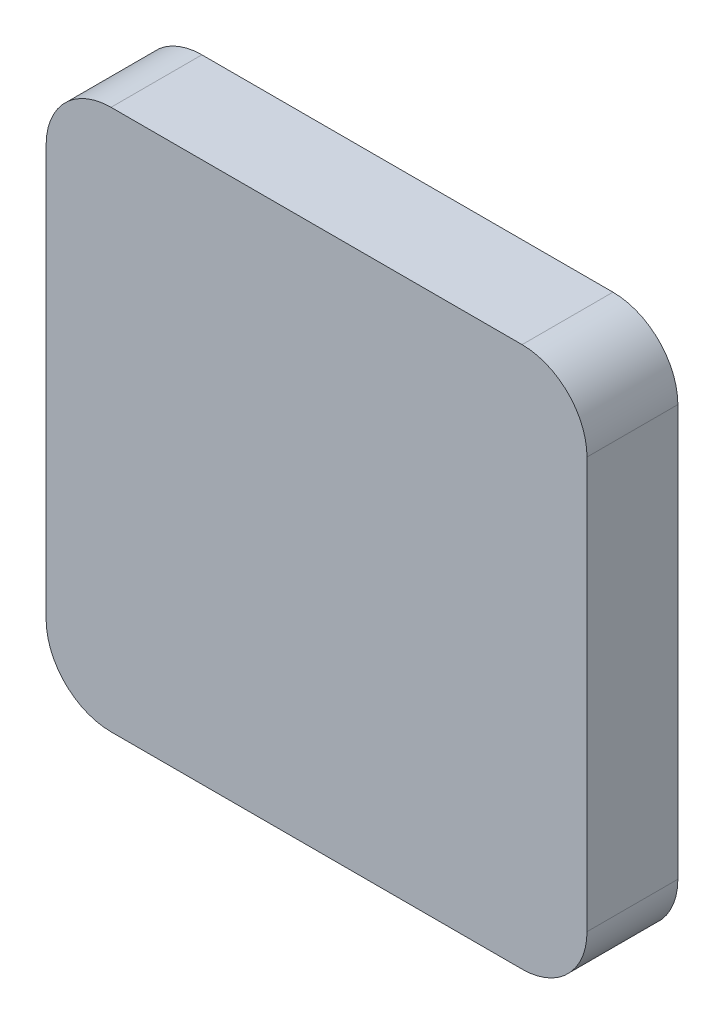
ISO-10303-21;
HEADER;
FILE_DESCRIPTION(('STEP AP214'),'2;1');
FILE_NAME('part.step','',(''),(''),'','','');
FILE_SCHEMA(('AUTOMOTIVE_DESIGN { 1 0 10303 214 1 1 1 1 }'));
ENDSEC;
DATA;
#1=APPLICATION_CONTEXT('core data for automotive mechanical design processes');
#2=APPLICATION_PROTOCOL_DEFINITION('international standard','automotive_design',2000,#1);
#3=PRODUCT_CONTEXT('',#1,'mechanical');
#4=PRODUCT('Part','Part','',(#3));
#5=PRODUCT_RELATED_PRODUCT_CATEGORY('part','',(#4));
#6=PRODUCT_DEFINITION_FORMATION('','',#4);
#7=PRODUCT_DEFINITION_CONTEXT('part definition',#1,'design');
#8=PRODUCT_DEFINITION('design','',#6,#7);
#9=PRODUCT_DEFINITION_SHAPE('','',#8);
#10=(LENGTH_UNIT() NAMED_UNIT(*) SI_UNIT(.MILLI.,.METRE.));
#11=(NAMED_UNIT(*) PLANE_ANGLE_UNIT() SI_UNIT($,.RADIAN.));
#12=(NAMED_UNIT(*) SI_UNIT($,.STERADIAN.) SOLID_ANGLE_UNIT());
#13=UNCERTAINTY_MEASURE_WITH_UNIT(LENGTH_MEASURE(1.E-05),#10,'distance_accuracy_value','');
#14=(GEOMETRIC_REPRESENTATION_CONTEXT(3) GLOBAL_UNCERTAINTY_ASSIGNED_CONTEXT((#13)) GLOBAL_UNIT_ASSIGNED_CONTEXT((#10,
#11,#12)) REPRESENTATION_CONTEXT('',''));
#15=CARTESIAN_POINT('',(0.,0.,0.));
#16=DIRECTION('',(0.,0.,1.));
#17=DIRECTION('',(1.,0.,0.));
#18=AXIS2_PLACEMENT_3D('',#15,#16,#17);
#19=CARTESIAN_POINT('',(0.,0.,8.5));
#20=DIRECTION('',(0.,0.,-1.));
#21=DIRECTION('',(-1.,0.,0.));
#22=AXIS2_PLACEMENT_3D('',#19,#20,#21);
#23=PLANE('',#22);
#24=DIRECTION('',(0.,1.,0.));
#25=VECTOR('',#24,1.);
#26=CARTESIAN_POINT('',(-11.,-10.5,8.5));
#27=LINE('',#26,#25);
#28=CARTESIAN_POINT('',(-11.,11.5,8.5));
#29=VERTEX_POINT('',#28);
#30=CARTESIAN_POINT('',(-11.,-7.5,8.5));
#31=VERTEX_POINT('',#30);
#32=EDGE_CURVE('E111',#29,#31,#27,.F.);
#33=ORIENTED_EDGE('',*,*,#32,.F.);
#34=CARTESIAN_POINT('',(-8.,11.5,8.5));
#35=DIRECTION('',(0.,0.,-1.));
#36=DIRECTION('',(-1.,0.,0.));
#37=AXIS2_PLACEMENT_3D('',#34,#35,#36);
#38=CIRCLE('',#37,3.);
#39=CARTESIAN_POINT('',(-8.,14.5,8.5));
#40=VERTEX_POINT('',#39);
#41=EDGE_CURVE('E129',#40,#29,#38,.F.);
#42=ORIENTED_EDGE('',*,*,#41,.F.);
#43=DIRECTION('',(1.,0.,0.));
#44=VECTOR('',#43,1.);
#45=CARTESIAN_POINT('',(-11.,14.5,8.5));
#46=LINE('',#45,#44);
#47=CARTESIAN_POINT('',(11.,14.5,8.5));
#48=VERTEX_POINT('',#47);
#49=EDGE_CURVE('E107',#48,#40,#46,.F.);
#50=ORIENTED_EDGE('',*,*,#49,.F.);
#51=CARTESIAN_POINT('',(11.,11.5,8.5));
#52=DIRECTION('',(0.,0.,-1.));
#53=DIRECTION('',(-1.,0.,0.));
#54=AXIS2_PLACEMENT_3D('',#51,#52,#53);
#55=CIRCLE('',#54,3.);
#56=CARTESIAN_POINT('',(14.,11.5,8.5));
#57=VERTEX_POINT('',#56);
#58=EDGE_CURVE('E127',#57,#48,#55,.F.);
#59=ORIENTED_EDGE('',*,*,#58,.F.);
#60=DIRECTION('',(0.,1.,0.));
#61=VECTOR('',#60,1.);
#62=CARTESIAN_POINT('',(14.,14.5,8.5));
#63=LINE('',#62,#61);
#64=CARTESIAN_POINT('',(14.,-7.5,8.5));
#65=VERTEX_POINT('',#64);
#66=EDGE_CURVE('E93',#65,#57,#63,.T.);
#67=ORIENTED_EDGE('',*,*,#66,.F.);
#68=CARTESIAN_POINT('',(11.,-7.5,8.5));
#69=DIRECTION('',(0.,0.,-1.));
#70=DIRECTION('',(-1.,0.,0.));
#71=AXIS2_PLACEMENT_3D('',#68,#69,#70);
#72=CIRCLE('',#71,3.);
#73=CARTESIAN_POINT('',(11.,-10.5,8.5));
#74=VERTEX_POINT('',#73);
#75=EDGE_CURVE('E20',#74,#65,#72,.F.);
#76=ORIENTED_EDGE('',*,*,#75,.F.);
#77=DIRECTION('',(1.,0.,0.));
#78=VECTOR('',#77,1.);
#79=CARTESIAN_POINT('',(14.,-10.5,8.5));
#80=LINE('',#79,#78);
#81=CARTESIAN_POINT('',(-8.,-10.5,8.5));
#82=VERTEX_POINT('',#81);
#83=EDGE_CURVE('E78',#82,#74,#80,.T.);
#84=ORIENTED_EDGE('',*,*,#83,.F.);
#85=CARTESIAN_POINT('',(-8.,-7.5,8.5));
#86=DIRECTION('',(0.,0.,-1.));
#87=DIRECTION('',(-1.,0.,0.));
#88=AXIS2_PLACEMENT_3D('',#85,#86,#87);
#89=CIRCLE('',#88,3.);
#90=EDGE_CURVE('E100',#31,#82,#89,.F.);
#91=ORIENTED_EDGE('',*,*,#90,.F.);
#92=EDGE_LOOP('',(#33,#42,#50,#59,#67,#76,#84,#91));
#93=FACE_BOUND('',#92,.T.);
#94=ADVANCED_FACE('F17',(#93),#23,.T.);
#95=CARTESIAN_POINT('',(11.,-7.5,12.7));
#96=DIRECTION('',(0.,0.,-1.));
#97=DIRECTION('',(-1.,0.,0.));
#98=AXIS2_PLACEMENT_3D('',#95,#96,#97);
#99=CYLINDRICAL_SURFACE('',#98,3.);
#100=ORIENTED_EDGE('',*,*,#75,.T.);
#101=DIRECTION('',(0.,0.,-1.));
#102=VECTOR('',#101,1.);
#103=CARTESIAN_POINT('',(14.,-7.5,12.7));
#104=LINE('',#103,#102);
#105=CARTESIAN_POINT('',(14.,-7.5,12.7));
#106=VERTEX_POINT('',#105);
#107=EDGE_CURVE('E126',#106,#65,#104,.T.);
#108=ORIENTED_EDGE('',*,*,#107,.F.);
#109=CARTESIAN_POINT('',(11.,-7.5,12.7));
#110=DIRECTION('',(0.,0.,-1.));
#111=DIRECTION('',(-1.,0.,0.));
#112=AXIS2_PLACEMENT_3D('',#109,#110,#111);
#113=CIRCLE('',#112,3.);
#114=CARTESIAN_POINT('',(11.,-10.5,12.7));
#115=VERTEX_POINT('',#114);
#116=EDGE_CURVE('E99',#106,#115,#113,.T.);
#117=ORIENTED_EDGE('',*,*,#116,.T.);
#118=DIRECTION('',(0.,0.,-1.));
#119=VECTOR('',#118,1.);
#120=CARTESIAN_POINT('',(11.,-10.5,12.7));
#121=LINE('',#120,#119);
#122=EDGE_CURVE('E83',#74,#115,#121,.F.);
#123=ORIENTED_EDGE('',*,*,#122,.F.);
#124=EDGE_LOOP('',(#100,#108,#117,#123));
#125=FACE_BOUND('',#124,.T.);
#126=ADVANCED_FACE('F98',(#125),#99,.T.);
#127=CARTESIAN_POINT('',(14.,-10.5,12.7));
#128=DIRECTION('',(0.,-1.,0.));
#129=DIRECTION('',(0.,0.,-1.));
#130=AXIS2_PLACEMENT_3D('',#127,#128,#129);
#131=PLANE('',#130);
#132=DIRECTION('',(-1.,0.,0.));
#133=VECTOR('',#132,1.);
#134=CARTESIAN_POINT('',(0.,-10.5,12.7));
#135=LINE('',#134,#133);
#136=CARTESIAN_POINT('',(-8.,-10.5,12.7));
#137=VERTEX_POINT('',#136);
#138=EDGE_CURVE('E124',#115,#137,#135,.T.);
#139=ORIENTED_EDGE('',*,*,#138,.T.);
#140=DIRECTION('',(0.,0.,-1.));
#141=VECTOR('',#140,1.);
#142=CARTESIAN_POINT('',(-8.,-10.5,12.7));
#143=LINE('',#142,#141);
#144=EDGE_CURVE('E85',#82,#137,#143,.F.);
#145=ORIENTED_EDGE('',*,*,#144,.F.);
#146=ORIENTED_EDGE('',*,*,#83,.T.);
#147=ORIENTED_EDGE('',*,*,#122,.T.);
#148=EDGE_LOOP('',(#139,#145,#146,#147));
#149=FACE_BOUND('',#148,.T.);
#150=ADVANCED_FACE('F81',(#149),#131,.T.);
#151=CARTESIAN_POINT('',(-8.,-7.5,12.7));
#152=DIRECTION('',(0.,0.,-1.));
#153=DIRECTION('',(-1.,0.,0.));
#154=AXIS2_PLACEMENT_3D('',#151,#152,#153);
#155=CYLINDRICAL_SURFACE('',#154,3.);
#156=ORIENTED_EDGE('',*,*,#90,.T.);
#157=ORIENTED_EDGE('',*,*,#144,.T.);
#158=CARTESIAN_POINT('',(-8.,-7.5,12.7));
#159=DIRECTION('',(0.,0.,-1.));
#160=DIRECTION('',(-1.,0.,0.));
#161=AXIS2_PLACEMENT_3D('',#158,#159,#160);
#162=CIRCLE('',#161,3.);
#163=CARTESIAN_POINT('',(-11.,-7.5,12.7));
#164=VERTEX_POINT('',#163);
#165=EDGE_CURVE('E121',#137,#164,#162,.T.);
#166=ORIENTED_EDGE('',*,*,#165,.T.);
#167=DIRECTION('',(0.,0.,1.));
#168=VECTOR('',#167,1.);
#169=CARTESIAN_POINT('',(-11.,-7.5,12.7));
#170=LINE('',#169,#168);
#171=EDGE_CURVE('E112',#31,#164,#170,.T.);
#172=ORIENTED_EDGE('',*,*,#171,.F.);
#173=EDGE_LOOP('',(#156,#157,#166,#172));
#174=FACE_BOUND('',#173,.T.);
#175=ADVANCED_FACE('F159',(#174),#155,.T.);
#176=CARTESIAN_POINT('',(-11.,-10.5,12.7));
#177=DIRECTION('',(-1.,0.,0.));
#178=DIRECTION('',(0.,0.,1.));
#179=AXIS2_PLACEMENT_3D('',#176,#177,#178);
#180=PLANE('',#179);
#181=DIRECTION('',(0.,1.,0.));
#182=VECTOR('',#181,1.);
#183=CARTESIAN_POINT('',(-11.,0.,12.7));
#184=LINE('',#183,#182);
#185=CARTESIAN_POINT('',(-11.,11.5,12.7));
#186=VERTEX_POINT('',#185);
#187=EDGE_CURVE('E120',#164,#186,#184,.T.);
#188=ORIENTED_EDGE('',*,*,#187,.T.);
#189=DIRECTION('',(0.,0.,-1.));
#190=VECTOR('',#189,1.);
#191=CARTESIAN_POINT('',(-11.,11.5,12.7));
#192=LINE('',#191,#190);
#193=EDGE_CURVE('E110',#29,#186,#192,.F.);
#194=ORIENTED_EDGE('',*,*,#193,.F.);
#195=ORIENTED_EDGE('',*,*,#32,.T.);
#196=ORIENTED_EDGE('',*,*,#171,.T.);
#197=EDGE_LOOP('',(#188,#194,#195,#196));
#198=FACE_BOUND('',#197,.T.);
#199=ADVANCED_FACE('F156',(#198),#180,.T.);
#200=CARTESIAN_POINT('',(-8.,11.5,12.7));
#201=DIRECTION('',(0.,0.,-1.));
#202=DIRECTION('',(-1.,0.,0.));
#203=AXIS2_PLACEMENT_3D('',#200,#201,#202);
#204=CYLINDRICAL_SURFACE('',#203,3.);
#205=ORIENTED_EDGE('',*,*,#41,.T.);
#206=ORIENTED_EDGE('',*,*,#193,.T.);
#207=CARTESIAN_POINT('',(-8.,11.5,12.7));
#208=DIRECTION('',(0.,0.,-1.));
#209=DIRECTION('',(-1.,0.,0.));
#210=AXIS2_PLACEMENT_3D('',#207,#208,#209);
#211=CIRCLE('',#210,3.);
#212=CARTESIAN_POINT('',(-8.,14.5,12.7));
#213=VERTEX_POINT('',#212);
#214=EDGE_CURVE('E117',#186,#213,#211,.T.);
#215=ORIENTED_EDGE('',*,*,#214,.T.);
#216=DIRECTION('',(0.,0.,1.));
#217=VECTOR('',#216,1.);
#218=CARTESIAN_POINT('',(-8.,14.5,12.7));
#219=LINE('',#218,#217);
#220=EDGE_CURVE('E109',#40,#213,#219,.T.);
#221=ORIENTED_EDGE('',*,*,#220,.F.);
#222=EDGE_LOOP('',(#205,#206,#215,#221));
#223=FACE_BOUND('',#222,.T.);
#224=ADVANCED_FACE('F154',(#223),#204,.T.);
#225=CARTESIAN_POINT('',(-11.,14.5,12.7));
#226=DIRECTION('',(0.,1.,0.));
#227=DIRECTION('',(0.,0.,1.));
#228=AXIS2_PLACEMENT_3D('',#225,#226,#227);
#229=PLANE('',#228);
#230=ORIENTED_EDGE('',*,*,#49,.T.);
#231=ORIENTED_EDGE('',*,*,#220,.T.);
#232=DIRECTION('',(-1.,0.,0.));
#233=VECTOR('',#232,1.);
#234=CARTESIAN_POINT('',(0.,14.5,12.7));
#235=LINE('',#234,#233);
#236=CARTESIAN_POINT('',(11.,14.5,12.7));
#237=VERTEX_POINT('',#236);
#238=EDGE_CURVE('E116',#213,#237,#235,.F.);
#239=ORIENTED_EDGE('',*,*,#238,.T.);
#240=DIRECTION('',(0.,0.,-1.));
#241=VECTOR('',#240,1.);
#242=CARTESIAN_POINT('',(11.,14.5,12.7));
#243=LINE('',#242,#241);
#244=EDGE_CURVE('E106',#48,#237,#243,.F.);
#245=ORIENTED_EDGE('',*,*,#244,.F.);
#246=EDGE_LOOP('',(#230,#231,#239,#245));
#247=FACE_BOUND('',#246,.T.);
#248=ADVANCED_FACE('F149',(#247),#229,.T.);
#249=CARTESIAN_POINT('',(11.,11.5,12.7));
#250=DIRECTION('',(0.,0.,-1.));
#251=DIRECTION('',(-1.,0.,0.));
#252=AXIS2_PLACEMENT_3D('',#249,#250,#251);
#253=CYLINDRICAL_SURFACE('',#252,3.);
#254=ORIENTED_EDGE('',*,*,#58,.T.);
#255=ORIENTED_EDGE('',*,*,#244,.T.);
#256=CARTESIAN_POINT('',(11.,11.5,12.7));
#257=DIRECTION('',(0.,0.,-1.));
#258=DIRECTION('',(-1.,0.,0.));
#259=AXIS2_PLACEMENT_3D('',#256,#257,#258);
#260=CIRCLE('',#259,3.);
#261=CARTESIAN_POINT('',(14.,11.5,12.7));
#262=VERTEX_POINT('',#261);
#263=EDGE_CURVE('E26',#237,#262,#260,.T.);
#264=ORIENTED_EDGE('',*,*,#263,.T.);
#265=DIRECTION('',(0.,0.,-1.));
#266=VECTOR('',#265,1.);
#267=CARTESIAN_POINT('',(14.,11.5,12.7));
#268=LINE('',#267,#266);
#269=EDGE_CURVE('E34',#57,#262,#268,.F.);
#270=ORIENTED_EDGE('',*,*,#269,.F.);
#271=EDGE_LOOP('',(#254,#255,#264,#270));
#272=FACE_BOUND('',#271,.T.);
#273=ADVANCED_FACE('F162',(#272),#253,.T.);
#274=CARTESIAN_POINT('',(14.,14.5,12.7));
#275=DIRECTION('',(1.,0.,0.));
#276=DIRECTION('',(0.,0.,-1.));
#277=AXIS2_PLACEMENT_3D('',#274,#275,#276);
#278=PLANE('',#277);
#279=DIRECTION('',(0.,1.,0.));
#280=VECTOR('',#279,1.);
#281=CARTESIAN_POINT('',(14.,0.,12.7));
#282=LINE('',#281,#280);
#283=EDGE_CURVE('E11',#262,#106,#282,.F.);
#284=ORIENTED_EDGE('',*,*,#283,.T.);
#285=ORIENTED_EDGE('',*,*,#107,.T.);
#286=ORIENTED_EDGE('',*,*,#66,.T.);
#287=ORIENTED_EDGE('',*,*,#269,.T.);
#288=EDGE_LOOP('',(#284,#285,#286,#287));
#289=FACE_BOUND('',#288,.T.);
#290=ADVANCED_FACE('F164',(#289),#278,.T.);
#291=CARTESIAN_POINT('',(0.,0.,12.7));
#292=DIRECTION('',(0.,0.,-1.));
#293=DIRECTION('',(-1.,0.,0.));
#294=AXIS2_PLACEMENT_3D('',#291,#292,#293);
#295=PLANE('',#294);
#296=ORIENTED_EDGE('',*,*,#263,.F.);
#297=ORIENTED_EDGE('',*,*,#238,.F.);
#298=ORIENTED_EDGE('',*,*,#214,.F.);
#299=ORIENTED_EDGE('',*,*,#187,.F.);
#300=ORIENTED_EDGE('',*,*,#165,.F.);
#301=ORIENTED_EDGE('',*,*,#138,.F.);
#302=ORIENTED_EDGE('',*,*,#116,.F.);
#303=ORIENTED_EDGE('',*,*,#283,.F.);
#304=EDGE_LOOP('',(#296,#297,#298,#299,#300,#301,#302,#303));
#305=FACE_BOUND('',#304,.T.);
#306=ADVANCED_FACE('F153',(#305),#295,.F.);
#307=CLOSED_SHELL('',(#94,#126,#150,#175,#199,#224,#248,#273,#290,#306));
#308=MANIFOLD_SOLID_BREP('B1',#307);
#309=ADVANCED_BREP_SHAPE_REPRESENTATION('',(#18,#308),#14);
#310=SHAPE_DEFINITION_REPRESENTATION(#9,#309);
ENDSEC;
END-ISO-10303-21;
